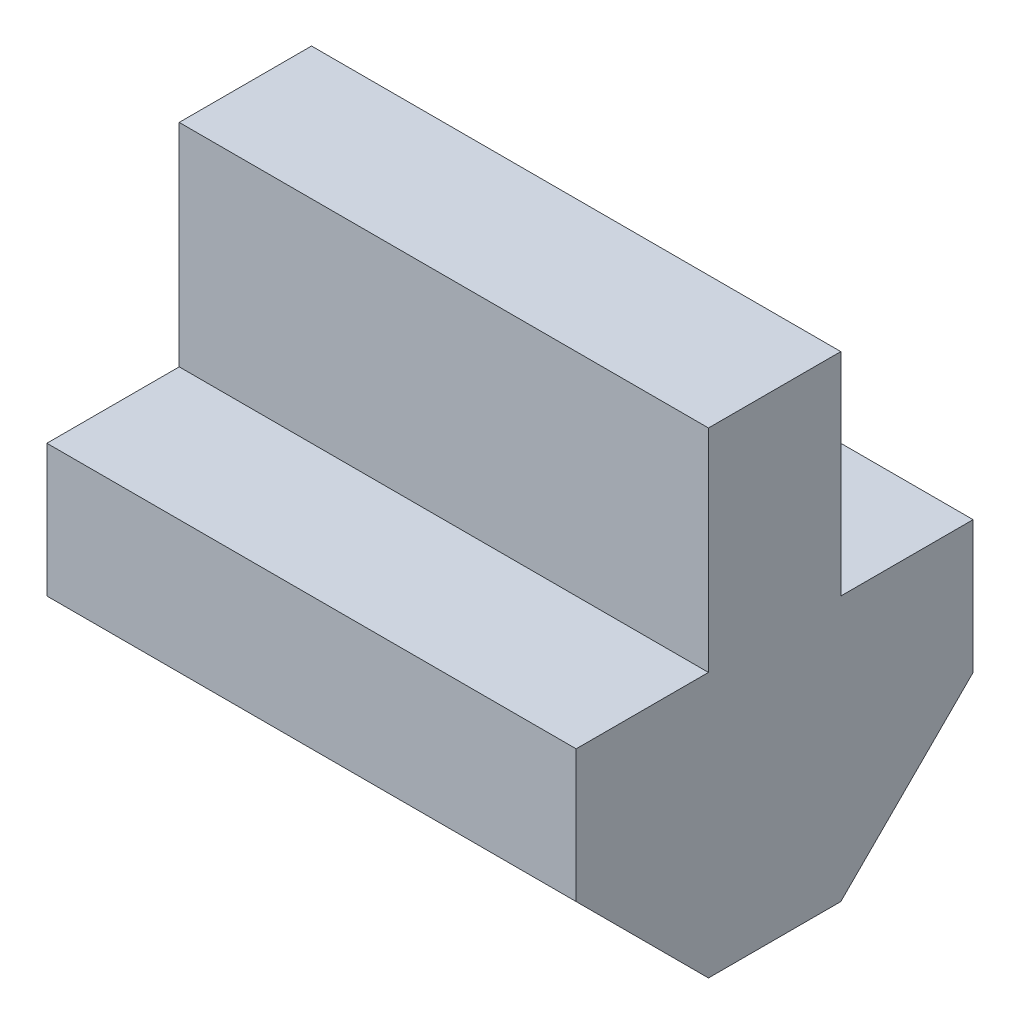
ISO-10303-21;
HEADER;
FILE_DESCRIPTION(('STEP AP214'),'2;1');
FILE_NAME('part.step','',(''),(''),'','','');
FILE_SCHEMA(('AUTOMOTIVE_DESIGN { 1 0 10303 214 1 1 1 1 }'));
ENDSEC;
DATA;
#1=APPLICATION_CONTEXT('core data for automotive mechanical design processes');
#2=APPLICATION_PROTOCOL_DEFINITION('international standard','automotive_design',2000,#1);
#3=PRODUCT_CONTEXT('',#1,'mechanical');
#4=PRODUCT('Part','Part','',(#3));
#5=PRODUCT_RELATED_PRODUCT_CATEGORY('part','',(#4));
#6=PRODUCT_DEFINITION_FORMATION('','',#4);
#7=PRODUCT_DEFINITION_CONTEXT('part definition',#1,'design');
#8=PRODUCT_DEFINITION('design','',#6,#7);
#9=PRODUCT_DEFINITION_SHAPE('','',#8);
#10=(LENGTH_UNIT() NAMED_UNIT(*) SI_UNIT(.MILLI.,.METRE.));
#11=(NAMED_UNIT(*) PLANE_ANGLE_UNIT() SI_UNIT($,.RADIAN.));
#12=(NAMED_UNIT(*) SI_UNIT($,.STERADIAN.) SOLID_ANGLE_UNIT());
#13=UNCERTAINTY_MEASURE_WITH_UNIT(LENGTH_MEASURE(1.E-05),#10,'distance_accuracy_value','');
#14=(GEOMETRIC_REPRESENTATION_CONTEXT(3) GLOBAL_UNCERTAINTY_ASSIGNED_CONTEXT((#13)) GLOBAL_UNIT_ASSIGNED_CONTEXT((#10,
#11,#12)) REPRESENTATION_CONTEXT('',''));
#15=CARTESIAN_POINT('',(0.,0.,0.));
#16=DIRECTION('',(0.,0.,1.));
#17=DIRECTION('',(1.,0.,0.));
#18=AXIS2_PLACEMENT_3D('',#15,#16,#17);
#19=CARTESIAN_POINT('',(0.,2.,0.));
#20=DIRECTION('',(0.,-1.,0.));
#21=DIRECTION('',(0.,0.,-1.));
#22=AXIS2_PLACEMENT_3D('',#19,#20,#21);
#23=PLANE('',#22);
#24=DIRECTION('',(1.,0.,0.));
#25=VECTOR('',#24,1.);
#26=CARTESIAN_POINT('',(-2.,2.,0.5));
#27=LINE('',#26,#25);
#28=CARTESIAN_POINT('',(-2.,2.,0.5));
#29=VERTEX_POINT('',#28);
#30=CARTESIAN_POINT('',(2.,2.,0.5));
#31=VERTEX_POINT('',#30);
#32=EDGE_CURVE('E128',#29,#31,#27,.T.);
#33=ORIENTED_EDGE('',*,*,#32,.F.);
#34=DIRECTION('',(0.,0.,-1.));
#35=VECTOR('',#34,1.);
#36=CARTESIAN_POINT('',(-2.,2.,1.5));
#37=LINE('',#36,#35);
#38=CARTESIAN_POINT('',(-2.,2.,1.5));
#39=VERTEX_POINT('',#38);
#40=EDGE_CURVE('E142',#39,#29,#37,.T.);
#41=ORIENTED_EDGE('',*,*,#40,.F.);
#42=DIRECTION('',(1.,0.,0.));
#43=VECTOR('',#42,1.);
#44=CARTESIAN_POINT('',(-2.,2.,1.5));
#45=LINE('',#44,#43);
#46=CARTESIAN_POINT('',(2.,2.,1.5));
#47=VERTEX_POINT('',#46);
#48=EDGE_CURVE('E151',#39,#47,#45,.T.);
#49=ORIENTED_EDGE('',*,*,#48,.T.);
#50=DIRECTION('',(0.,0.,-1.));
#51=VECTOR('',#50,1.);
#52=CARTESIAN_POINT('',(2.,2.,1.5));
#53=LINE('',#52,#51);
#54=EDGE_CURVE('E149',#47,#31,#53,.T.);
#55=ORIENTED_EDGE('',*,*,#54,.T.);
#56=EDGE_LOOP('',(#33,#41,#49,#55));
#57=FACE_BOUND('',#56,.T.);
#58=ADVANCED_FACE('F32',(#57),#23,.F.);
#59=DIRECTION('',(-1.,0.,0.));
#60=VECTOR('',#59,1.);
#61=CARTESIAN_POINT('',(-2.,2.,-0.5));
#62=LINE('',#61,#60);
#63=CARTESIAN_POINT('',(2.,2.,-0.5));
#64=VERTEX_POINT('',#63);
#65=CARTESIAN_POINT('',(-2.,2.,-0.5));
#66=VERTEX_POINT('',#65);
#67=EDGE_CURVE('E305',#64,#66,#62,.T.);
#68=ORIENTED_EDGE('',*,*,#67,.F.);
#69=CARTESIAN_POINT('',(2.,2.,-1.5));
#70=VERTEX_POINT('',#69);
#71=EDGE_CURVE('E132',#64,#70,#53,.T.);
#72=ORIENTED_EDGE('',*,*,#71,.T.);
#73=DIRECTION('',(1.,0.,0.));
#74=VECTOR('',#73,1.);
#75=CARTESIAN_POINT('',(-2.,2.,-1.5));
#76=LINE('',#75,#74);
#77=CARTESIAN_POINT('',(-2.,2.,-1.5));
#78=VERTEX_POINT('',#77);
#79=EDGE_CURVE('E145',#78,#70,#76,.T.);
#80=ORIENTED_EDGE('',*,*,#79,.F.);
#81=EDGE_CURVE('E146',#66,#78,#37,.T.);
#82=ORIENTED_EDGE('',*,*,#81,.F.);
#83=EDGE_LOOP('',(#68,#72,#80,#82));
#84=FACE_BOUND('',#83,.T.);
#85=ADVANCED_FACE('F203',(#84),#23,.F.);
#86=CARTESIAN_POINT('',(-2.,2.,1.5));
#87=DIRECTION('',(-1.,0.,0.));
#88=DIRECTION('',(0.,0.,1.));
#89=AXIS2_PLACEMENT_3D('',#86,#87,#88);
#90=PLANE('',#89);
#91=DIRECTION('',(0.,-1.,0.));
#92=VECTOR('',#91,1.);
#93=CARTESIAN_POINT('',(-2.,2.,-1.5));
#94=LINE('',#93,#92);
#95=CARTESIAN_POINT('',(-2.,1.,-1.5));
#96=VERTEX_POINT('',#95);
#97=EDGE_CURVE('E152',#78,#96,#94,.T.);
#98=ORIENTED_EDGE('',*,*,#97,.T.);
#99=DIRECTION('',(0.,0.707106781186549,-0.707106781186546));
#100=VECTOR('',#99,1.);
#101=CARTESIAN_POINT('',(-2.,0.,-0.500000000000004));
#102=LINE('',#101,#100);
#103=CARTESIAN_POINT('',(-2.,0.,-0.5));
#104=VERTEX_POINT('',#103);
#105=EDGE_CURVE('E11',#96,#104,#102,.F.);
#106=ORIENTED_EDGE('',*,*,#105,.T.);
#107=DIRECTION('',(0.,0.,-1.));
#108=VECTOR('',#107,1.);
#109=CARTESIAN_POINT('',(-2.,0.,1.5));
#110=LINE('',#109,#108);
#111=CARTESIAN_POINT('',(-2.,0.,0.499999999999997));
#112=VERTEX_POINT('',#111);
#113=EDGE_CURVE('E133',#112,#104,#110,.T.);
#114=ORIENTED_EDGE('',*,*,#113,.F.);
#115=DIRECTION('',(0.,0.707106781186546,0.707106781186549));
#116=VECTOR('',#115,1.);
#117=CARTESIAN_POINT('',(-2.,1.5,2.));
#118=LINE('',#117,#116);
#119=CARTESIAN_POINT('',(-2.,0.999999999999999,1.5));
#120=VERTEX_POINT('',#119);
#121=EDGE_CURVE('E171',#112,#120,#118,.T.);
#122=ORIENTED_EDGE('',*,*,#121,.T.);
#123=DIRECTION('',(0.,-1.,0.));
#124=VECTOR('',#123,1.);
#125=CARTESIAN_POINT('',(-2.,2.,1.5));
#126=LINE('',#125,#124);
#127=EDGE_CURVE('E155',#39,#120,#126,.T.);
#128=ORIENTED_EDGE('',*,*,#127,.F.);
#129=ORIENTED_EDGE('',*,*,#40,.T.);
#130=DIRECTION('',(0.,-1.,0.));
#131=VECTOR('',#130,1.);
#132=CARTESIAN_POINT('',(-2.,3.6,0.5));
#133=LINE('',#132,#131);
#134=CARTESIAN_POINT('',(-2.,3.6,0.5));
#135=VERTEX_POINT('',#134);
#136=EDGE_CURVE('E138',#135,#29,#133,.T.);
#137=ORIENTED_EDGE('',*,*,#136,.F.);
#138=DIRECTION('',(0.,0.,1.));
#139=VECTOR('',#138,1.);
#140=CARTESIAN_POINT('',(-2.,3.6,0.5));
#141=LINE('',#140,#139);
#142=CARTESIAN_POINT('',(-2.,3.6,-0.5));
#143=VERTEX_POINT('',#142);
#144=EDGE_CURVE('E119',#143,#135,#141,.T.);
#145=ORIENTED_EDGE('',*,*,#144,.F.);
#146=DIRECTION('',(0.,-1.,0.));
#147=VECTOR('',#146,1.);
#148=CARTESIAN_POINT('',(-2.,3.6,-0.5));
#149=LINE('',#148,#147);
#150=EDGE_CURVE('E116',#143,#66,#149,.T.);
#151=ORIENTED_EDGE('',*,*,#150,.T.);
#152=ORIENTED_EDGE('',*,*,#81,.T.);
#153=EDGE_LOOP('',(#98,#106,#114,#122,#128,#129,#137,#145,#151,#152));
#154=FACE_BOUND('',#153,.T.);
#155=ADVANCED_FACE('F195',(#154),#90,.T.);
#156=CARTESIAN_POINT('',(-2.,2.,1.5));
#157=DIRECTION('',(0.,0.,-1.));
#158=DIRECTION('',(-1.,0.,0.));
#159=AXIS2_PLACEMENT_3D('',#156,#157,#158);
#160=PLANE('',#159);
#161=ORIENTED_EDGE('',*,*,#127,.T.);
#162=DIRECTION('',(1.,0.,0.));
#163=VECTOR('',#162,1.);
#164=CARTESIAN_POINT('',(2.,0.999999999999999,1.5));
#165=LINE('',#164,#163);
#166=CARTESIAN_POINT('',(2.,0.999999999999999,1.5));
#167=VERTEX_POINT('',#166);
#168=EDGE_CURVE('E158',#120,#167,#165,.T.);
#169=ORIENTED_EDGE('',*,*,#168,.T.);
#170=DIRECTION('',(0.,-1.,0.));
#171=VECTOR('',#170,1.);
#172=CARTESIAN_POINT('',(2.,2.,1.5));
#173=LINE('',#172,#171);
#174=EDGE_CURVE('E159',#47,#167,#173,.T.);
#175=ORIENTED_EDGE('',*,*,#174,.F.);
#176=ORIENTED_EDGE('',*,*,#48,.F.);
#177=EDGE_LOOP('',(#161,#169,#175,#176));
#178=FACE_BOUND('',#177,.T.);
#179=ADVANCED_FACE('F191',(#178),#160,.F.);
#180=CARTESIAN_POINT('',(2.,2.,1.5));
#181=DIRECTION('',(-1.,0.,0.));
#182=DIRECTION('',(0.,0.,1.));
#183=AXIS2_PLACEMENT_3D('',#180,#181,#182);
#184=PLANE('',#183);
#185=DIRECTION('',(0.,0.,-1.));
#186=VECTOR('',#185,1.);
#187=CARTESIAN_POINT('',(2.,0.,1.5));
#188=LINE('',#187,#186);
#189=CARTESIAN_POINT('',(2.,0.,0.499999999999997));
#190=VERTEX_POINT('',#189);
#191=CARTESIAN_POINT('',(2.,0.,-0.5));
#192=VERTEX_POINT('',#191);
#193=EDGE_CURVE('E136',#190,#192,#188,.T.);
#194=ORIENTED_EDGE('',*,*,#193,.T.);
#195=DIRECTION('',(0.,-0.707106781186549,0.707106781186546));
#196=VECTOR('',#195,1.);
#197=CARTESIAN_POINT('',(2.,0.,-0.5));
#198=LINE('',#197,#196);
#199=CARTESIAN_POINT('',(2.,1.,-1.5));
#200=VERTEX_POINT('',#199);
#201=EDGE_CURVE('E54',#192,#200,#198,.F.);
#202=ORIENTED_EDGE('',*,*,#201,.T.);
#203=DIRECTION('',(0.,-1.,0.));
#204=VECTOR('',#203,1.);
#205=CARTESIAN_POINT('',(2.,2.,-1.5));
#206=LINE('',#205,#204);
#207=EDGE_CURVE('E162',#70,#200,#206,.T.);
#208=ORIENTED_EDGE('',*,*,#207,.F.);
#209=ORIENTED_EDGE('',*,*,#71,.F.);
#210=DIRECTION('',(0.,-1.,0.));
#211=VECTOR('',#210,1.);
#212=CARTESIAN_POINT('',(2.,3.6,-0.5));
#213=LINE('',#212,#211);
#214=CARTESIAN_POINT('',(2.,3.6,-0.5));
#215=VERTEX_POINT('',#214);
#216=EDGE_CURVE('E114',#215,#64,#213,.T.);
#217=ORIENTED_EDGE('',*,*,#216,.F.);
#218=DIRECTION('',(0.,0.,-1.));
#219=VECTOR('',#218,1.);
#220=CARTESIAN_POINT('',(2.,3.6,0.5));
#221=LINE('',#220,#219);
#222=CARTESIAN_POINT('',(2.,3.6,0.5));
#223=VERTEX_POINT('',#222);
#224=EDGE_CURVE('E120',#223,#215,#221,.T.);
#225=ORIENTED_EDGE('',*,*,#224,.F.);
#226=DIRECTION('',(0.,-1.,0.));
#227=VECTOR('',#226,1.);
#228=CARTESIAN_POINT('',(2.,3.6,0.5));
#229=LINE('',#228,#227);
#230=EDGE_CURVE('E304',#223,#31,#229,.T.);
#231=ORIENTED_EDGE('',*,*,#230,.T.);
#232=ORIENTED_EDGE('',*,*,#54,.F.);
#233=ORIENTED_EDGE('',*,*,#174,.T.);
#234=DIRECTION('',(0.,-0.707106781186546,-0.707106781186549));
#235=VECTOR('',#234,1.);
#236=CARTESIAN_POINT('',(2.,0.999999999999999,1.5));
#237=LINE('',#236,#235);
#238=EDGE_CURVE('E167',#167,#190,#237,.T.);
#239=ORIENTED_EDGE('',*,*,#238,.T.);
#240=EDGE_LOOP('',(#194,#202,#208,#209,#217,#225,#231,#232,#233,#239));
#241=FACE_BOUND('',#240,.T.);
#242=ADVANCED_FACE('F131',(#241),#184,.F.);
#243=CARTESIAN_POINT('',(-2.,2.,-1.5));
#244=DIRECTION('',(0.,0.,-1.));
#245=DIRECTION('',(-1.,0.,0.));
#246=AXIS2_PLACEMENT_3D('',#243,#244,#245);
#247=PLANE('',#246);
#248=ORIENTED_EDGE('',*,*,#207,.T.);
#249=DIRECTION('',(-1.,0.,0.));
#250=VECTOR('',#249,1.);
#251=CARTESIAN_POINT('',(-2.,1.,-1.5));
#252=LINE('',#251,#250);
#253=EDGE_CURVE('E40',#200,#96,#252,.T.);
#254=ORIENTED_EDGE('',*,*,#253,.T.);
#255=ORIENTED_EDGE('',*,*,#97,.F.);
#256=ORIENTED_EDGE('',*,*,#79,.T.);
#257=EDGE_LOOP('',(#248,#254,#255,#256));
#258=FACE_BOUND('',#257,.T.);
#259=ADVANCED_FACE('F215',(#258),#247,.T.);
#260=CARTESIAN_POINT('',(0.,0.,0.));
#261=DIRECTION('',(0.,-1.,0.));
#262=DIRECTION('',(0.,0.,-1.));
#263=AXIS2_PLACEMENT_3D('',#260,#261,#262);
#264=PLANE('',#263);
#265=ORIENTED_EDGE('',*,*,#113,.T.);
#266=DIRECTION('',(1.,0.,0.));
#267=VECTOR('',#266,1.);
#268=CARTESIAN_POINT('',(0.,0.,-0.5));
#269=LINE('',#268,#267);
#270=EDGE_CURVE('E173',#104,#192,#269,.T.);
#271=ORIENTED_EDGE('',*,*,#270,.T.);
#272=ORIENTED_EDGE('',*,*,#193,.F.);
#273=DIRECTION('',(-1.,0.,0.));
#274=VECTOR('',#273,1.);
#275=CARTESIAN_POINT('',(-2.,0.,0.499999999999997));
#276=LINE('',#275,#274);
#277=EDGE_CURVE('E169',#190,#112,#276,.T.);
#278=ORIENTED_EDGE('',*,*,#277,.T.);
#279=EDGE_LOOP('',(#265,#271,#272,#278));
#280=FACE_BOUND('',#279,.T.);
#281=ADVANCED_FACE('F179',(#280),#264,.T.);
#282=CARTESIAN_POINT('',(-2.,3.6,-0.5));
#283=DIRECTION('',(0.,0.,1.));
#284=DIRECTION('',(1.,0.,0.));
#285=AXIS2_PLACEMENT_3D('',#282,#283,#284);
#286=PLANE('',#285);
#287=ORIENTED_EDGE('',*,*,#67,.T.);
#288=ORIENTED_EDGE('',*,*,#150,.F.);
#289=DIRECTION('',(-1.,0.,0.));
#290=VECTOR('',#289,1.);
#291=CARTESIAN_POINT('',(-2.,3.6,-0.5));
#292=LINE('',#291,#290);
#293=EDGE_CURVE('E109',#215,#143,#292,.T.);
#294=ORIENTED_EDGE('',*,*,#293,.F.);
#295=ORIENTED_EDGE('',*,*,#216,.T.);
#296=EDGE_LOOP('',(#287,#288,#294,#295));
#297=FACE_BOUND('',#296,.T.);
#298=ADVANCED_FACE('F112',(#297),#286,.F.);
#299=CARTESIAN_POINT('',(-2.,3.6,0.5));
#300=DIRECTION('',(0.,0.,-1.));
#301=DIRECTION('',(-1.,0.,0.));
#302=AXIS2_PLACEMENT_3D('',#299,#300,#301);
#303=PLANE('',#302);
#304=ORIENTED_EDGE('',*,*,#32,.T.);
#305=ORIENTED_EDGE('',*,*,#230,.F.);
#306=DIRECTION('',(1.,0.,0.));
#307=VECTOR('',#306,1.);
#308=CARTESIAN_POINT('',(-2.,3.6,0.5));
#309=LINE('',#308,#307);
#310=EDGE_CURVE('E125',#135,#223,#309,.T.);
#311=ORIENTED_EDGE('',*,*,#310,.F.);
#312=ORIENTED_EDGE('',*,*,#136,.T.);
#313=EDGE_LOOP('',(#304,#305,#311,#312));
#314=FACE_BOUND('',#313,.T.);
#315=ADVANCED_FACE('F251',(#314),#303,.F.);
#316=CARTESIAN_POINT('',(0.,3.6,0.));
#317=DIRECTION('',(0.,-1.,0.));
#318=DIRECTION('',(0.,0.,-1.));
#319=AXIS2_PLACEMENT_3D('',#316,#317,#318);
#320=PLANE('',#319);
#321=ORIENTED_EDGE('',*,*,#224,.T.);
#322=ORIENTED_EDGE('',*,*,#293,.T.);
#323=ORIENTED_EDGE('',*,*,#144,.T.);
#324=ORIENTED_EDGE('',*,*,#310,.T.);
#325=EDGE_LOOP('',(#321,#322,#323,#324));
#326=FACE_BOUND('',#325,.T.);
#327=ADVANCED_FACE('F123',(#326),#320,.F.);
#328=CARTESIAN_POINT('',(-2.,0.999999999999999,1.5));
#329=DIRECTION('',(0.,-0.707106781186549,0.707106781186546));
#330=DIRECTION('',(-1.,0.,0.));
#331=AXIS2_PLACEMENT_3D('',#328,#329,#330);
#332=PLANE('',#331);
#333=ORIENTED_EDGE('',*,*,#121,.F.);
#334=ORIENTED_EDGE('',*,*,#277,.F.);
#335=ORIENTED_EDGE('',*,*,#238,.F.);
#336=ORIENTED_EDGE('',*,*,#168,.F.);
#337=EDGE_LOOP('',(#333,#334,#335,#336));
#338=FACE_BOUND('',#337,.T.);
#339=ADVANCED_FACE('F189',(#338),#332,.T.);
#340=CARTESIAN_POINT('',(0.,0.,-0.5));
#341=DIRECTION('',(0.,0.707106781186546,0.707106781186549));
#342=DIRECTION('',(1.,0.,0.));
#343=AXIS2_PLACEMENT_3D('',#340,#341,#342);
#344=PLANE('',#343);
#345=ORIENTED_EDGE('',*,*,#105,.F.);
#346=ORIENTED_EDGE('',*,*,#253,.F.);
#347=ORIENTED_EDGE('',*,*,#201,.F.);
#348=ORIENTED_EDGE('',*,*,#270,.F.);
#349=EDGE_LOOP('',(#345,#346,#347,#348));
#350=FACE_BOUND('',#349,.T.);
#351=ADVANCED_FACE('F34',(#350),#344,.F.);
#352=CLOSED_SHELL('',(#58,#85,#155,#179,#242,#259,#281,#298,#315,#327,#339,#351));
#353=MANIFOLD_SOLID_BREP('B2',#352);
#354=ADVANCED_BREP_SHAPE_REPRESENTATION('',(#18,#353),#14);
#355=SHAPE_DEFINITION_REPRESENTATION(#9,#354);
ENDSEC;
END-ISO-10303-21;
